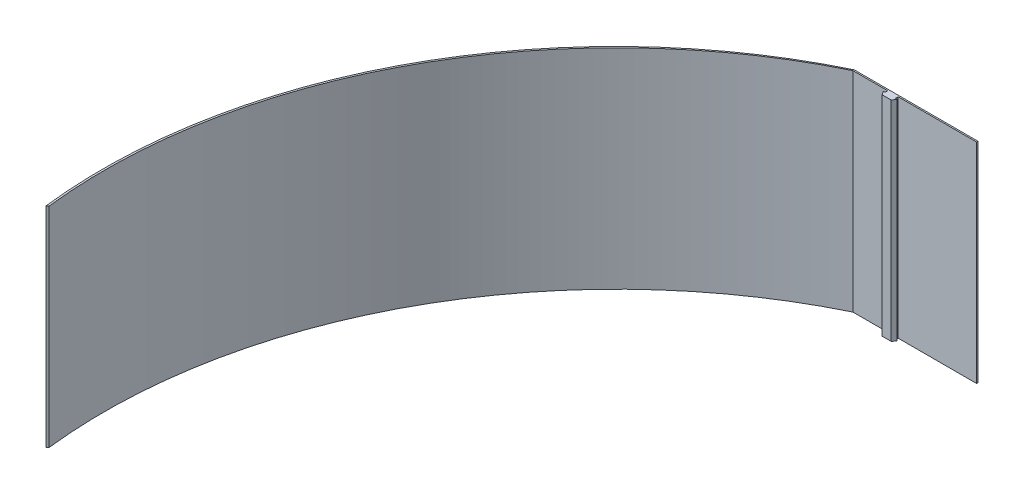
ISO-10303-21;
HEADER;
FILE_DESCRIPTION(('STEP AP214'),'2;1');
FILE_NAME('part.step','',(''),(''),'','','');
FILE_SCHEMA(('AUTOMOTIVE_DESIGN { 1 0 10303 214 1 1 1 1 }'));
ENDSEC;
DATA;
#1=APPLICATION_CONTEXT('core data for automotive mechanical design processes');
#2=APPLICATION_PROTOCOL_DEFINITION('international standard','automotive_design',2000,#1);
#3=PRODUCT_CONTEXT('',#1,'mechanical');
#4=PRODUCT('Part','Part','',(#3));
#5=PRODUCT_RELATED_PRODUCT_CATEGORY('part','',(#4));
#6=PRODUCT_DEFINITION_FORMATION('','',#4);
#7=PRODUCT_DEFINITION_CONTEXT('part definition',#1,'design');
#8=PRODUCT_DEFINITION('design','',#6,#7);
#9=PRODUCT_DEFINITION_SHAPE('','',#8);
#10=(LENGTH_UNIT() NAMED_UNIT(*) SI_UNIT(.MILLI.,.METRE.));
#11=(NAMED_UNIT(*) PLANE_ANGLE_UNIT() SI_UNIT($,.RADIAN.));
#12=(NAMED_UNIT(*) SI_UNIT($,.STERADIAN.) SOLID_ANGLE_UNIT());
#13=UNCERTAINTY_MEASURE_WITH_UNIT(LENGTH_MEASURE(1.E-05),#10,'distance_accuracy_value','');
#14=(GEOMETRIC_REPRESENTATION_CONTEXT(3) GLOBAL_UNCERTAINTY_ASSIGNED_CONTEXT((#13)) GLOBAL_UNIT_ASSIGNED_CONTEXT((#10,
#11,#12)) REPRESENTATION_CONTEXT('',''));
#15=CARTESIAN_POINT('',(0.,0.,0.));
#16=DIRECTION('',(0.,0.,1.));
#17=DIRECTION('',(1.,0.,0.));
#18=AXIS2_PLACEMENT_3D('',#15,#16,#17);
#19=CARTESIAN_POINT('',(-3.,120.,0.));
#20=DIRECTION('',(0.,0.,-1.));
#21=DIRECTION('',(-1.,0.,0.));
#22=AXIS2_PLACEMENT_3D('',#19,#20,#21);
#23=PLANE('',#22);
#24=DIRECTION('',(1.,0.,0.));
#25=VECTOR('',#24,1.);
#26=CARTESIAN_POINT('',(-3.,0.,0.));
#27=LINE('',#26,#25);
#28=CARTESIAN_POINT('',(-23.,0.,0.));
#29=VERTEX_POINT('',#28);
#30=CARTESIAN_POINT('',(-3.,0.,0.));
#31=VERTEX_POINT('',#30);
#32=EDGE_CURVE('E165',#29,#31,#27,.T.);
#33=ORIENTED_EDGE('',*,*,#32,.T.);
#34=DIRECTION('',(0.,-1.,0.));
#35=VECTOR('',#34,1.);
#36=CARTESIAN_POINT('',(-3.,120.,0.));
#37=LINE('',#36,#35);
#38=CARTESIAN_POINT('',(-3.,120.,0.));
#39=VERTEX_POINT('',#38);
#40=EDGE_CURVE('E11',#39,#31,#37,.T.);
#41=ORIENTED_EDGE('',*,*,#40,.F.);
#42=DIRECTION('',(1.,0.,0.));
#43=VECTOR('',#42,1.);
#44=CARTESIAN_POINT('',(-3.,120.,0.));
#45=LINE('',#44,#43);
#46=CARTESIAN_POINT('',(-23.,120.,0.));
#47=VERTEX_POINT('',#46);
#48=EDGE_CURVE('E191',#47,#39,#45,.T.);
#49=ORIENTED_EDGE('',*,*,#48,.F.);
#50=DIRECTION('',(0.,-1.,0.));
#51=VECTOR('',#50,1.);
#52=CARTESIAN_POINT('',(-23.,120.,0.));
#53=LINE('',#52,#51);
#54=EDGE_CURVE('E161',#47,#29,#53,.T.);
#55=ORIENTED_EDGE('',*,*,#54,.T.);
#56=EDGE_LOOP('',(#33,#41,#49,#55));
#57=FACE_BOUND('',#56,.T.);
#58=ADVANCED_FACE('F33',(#57),#23,.F.);
#59=CARTESIAN_POINT('',(-3.,120.,0.));
#60=DIRECTION('',(1.,0.,0.));
#61=DIRECTION('',(0.,0.,-1.));
#62=AXIS2_PLACEMENT_3D('',#59,#60,#61);
#63=PLANE('',#62);
#64=DIRECTION('',(0.,0.,1.));
#65=VECTOR('',#64,1.);
#66=CARTESIAN_POINT('',(-3.,0.,0.));
#67=LINE('',#66,#65);
#68=CARTESIAN_POINT('',(-3.,0.,1.6));
#69=VERTEX_POINT('',#68);
#70=EDGE_CURVE('E168',#31,#69,#67,.T.);
#71=ORIENTED_EDGE('',*,*,#70,.T.);
#72=DIRECTION('',(0.,-1.,0.));
#73=VECTOR('',#72,1.);
#74=CARTESIAN_POINT('',(-3.,120.,1.6));
#75=LINE('',#74,#73);
#76=CARTESIAN_POINT('',(-3.,120.,1.6));
#77=VERTEX_POINT('',#76);
#78=EDGE_CURVE('E41',#77,#69,#75,.T.);
#79=ORIENTED_EDGE('',*,*,#78,.F.);
#80=DIRECTION('',(0.,0.,1.));
#81=VECTOR('',#80,1.);
#82=CARTESIAN_POINT('',(-3.,120.,0.));
#83=LINE('',#82,#81);
#84=EDGE_CURVE('E110',#39,#77,#83,.T.);
#85=ORIENTED_EDGE('',*,*,#84,.F.);
#86=ORIENTED_EDGE('',*,*,#40,.T.);
#87=EDGE_LOOP('',(#71,#79,#85,#86));
#88=FACE_BOUND('',#87,.T.);
#89=ADVANCED_FACE('F279',(#88),#63,.F.);
#90=CARTESIAN_POINT('',(-3.,120.,1.6));
#91=DIRECTION('',(0.,0.,1.));
#92=DIRECTION('',(1.,0.,0.));
#93=AXIS2_PLACEMENT_3D('',#90,#91,#92);
#94=PLANE('',#93);
#95=DIRECTION('',(-1.,0.,0.));
#96=VECTOR('',#95,1.);
#97=CARTESIAN_POINT('',(-3.,0.,1.6));
#98=LINE('',#97,#96);
#99=CARTESIAN_POINT('',(-4.,0.,1.6));
#100=VERTEX_POINT('',#99);
#101=EDGE_CURVE('E170',#69,#100,#98,.T.);
#102=ORIENTED_EDGE('',*,*,#101,.T.);
#103=DIRECTION('',(0.,-1.,0.));
#104=VECTOR('',#103,1.);
#105=CARTESIAN_POINT('',(-4.,120.,1.6));
#106=LINE('',#105,#104);
#107=CARTESIAN_POINT('',(-4.,120.,1.6));
#108=VERTEX_POINT('',#107);
#109=EDGE_CURVE('E216',#108,#100,#106,.T.);
#110=ORIENTED_EDGE('',*,*,#109,.F.);
#111=DIRECTION('',(-1.,0.,0.));
#112=VECTOR('',#111,1.);
#113=CARTESIAN_POINT('',(-3.,120.,1.6));
#114=LINE('',#113,#112);
#115=EDGE_CURVE('E224',#77,#108,#114,.T.);
#116=ORIENTED_EDGE('',*,*,#115,.F.);
#117=ORIENTED_EDGE('',*,*,#78,.T.);
#118=EDGE_LOOP('',(#102,#110,#116,#117));
#119=FACE_BOUND('',#118,.T.);
#120=ADVANCED_FACE('F222',(#119),#94,.F.);
#121=CARTESIAN_POINT('',(-4.,120.,1.6));
#122=DIRECTION('',(0.819152044288993,0.,-0.573576436351045));
#123=DIRECTION('',(-0.573576436351045,0.,-0.819152044288993));
#124=AXIS2_PLACEMENT_3D('',#121,#122,#123);
#125=PLANE('',#124);
#126=DIRECTION('',(0.573576436351045,0.,0.819152044288993));
#127=VECTOR('',#126,1.);
#128=CARTESIAN_POINT('',(-4.,0.,1.6));
#129=LINE('',#128,#127);
#130=CARTESIAN_POINT('',(-2.59958492358059,0.,3.6));
#131=VERTEX_POINT('',#130);
#132=EDGE_CURVE('E172',#100,#131,#129,.T.);
#133=ORIENTED_EDGE('',*,*,#132,.T.);
#134=DIRECTION('',(0.,-1.,0.));
#135=VECTOR('',#134,1.);
#136=CARTESIAN_POINT('',(-2.59958492358059,120.,3.6));
#137=LINE('',#136,#135);
#138=CARTESIAN_POINT('',(-2.59958492358059,120.,3.6));
#139=VERTEX_POINT('',#138);
#140=EDGE_CURVE('E213',#139,#131,#137,.T.);
#141=ORIENTED_EDGE('',*,*,#140,.F.);
#142=DIRECTION('',(0.573576436351045,0.,0.819152044288993));
#143=VECTOR('',#142,1.);
#144=CARTESIAN_POINT('',(-4.,120.,1.6));
#145=LINE('',#144,#143);
#146=EDGE_CURVE('E242',#108,#139,#145,.T.);
#147=ORIENTED_EDGE('',*,*,#146,.F.);
#148=ORIENTED_EDGE('',*,*,#109,.T.);
#149=EDGE_LOOP('',(#133,#141,#147,#148));
#150=FACE_BOUND('',#149,.T.);
#151=ADVANCED_FACE('F233',(#150),#125,.F.);
#152=CARTESIAN_POINT('',(-2.59958492358059,120.,3.6));
#153=DIRECTION('',(0.,0.,-1.));
#154=DIRECTION('',(-1.,0.,0.));
#155=AXIS2_PLACEMENT_3D('',#152,#153,#154);
#156=PLANE('',#155);
#157=DIRECTION('',(1.,0.,0.));
#158=VECTOR('',#157,1.);
#159=CARTESIAN_POINT('',(-2.59958492358059,0.,3.6));
#160=LINE('',#159,#158);
#161=CARTESIAN_POINT('',(2.59958492358059,0.,3.6));
#162=VERTEX_POINT('',#161);
#163=EDGE_CURVE('E174',#131,#162,#160,.T.);
#164=ORIENTED_EDGE('',*,*,#163,.T.);
#165=DIRECTION('',(0.,-1.,0.));
#166=VECTOR('',#165,1.);
#167=CARTESIAN_POINT('',(2.59958492358059,120.,3.6));
#168=LINE('',#167,#166);
#169=CARTESIAN_POINT('',(2.59958492358059,120.,3.6));
#170=VERTEX_POINT('',#169);
#171=EDGE_CURVE('E210',#170,#162,#168,.T.);
#172=ORIENTED_EDGE('',*,*,#171,.F.);
#173=DIRECTION('',(1.,0.,0.));
#174=VECTOR('',#173,1.);
#175=CARTESIAN_POINT('',(-2.59958492358059,120.,3.6));
#176=LINE('',#175,#174);
#177=EDGE_CURVE('E239',#139,#170,#176,.T.);
#178=ORIENTED_EDGE('',*,*,#177,.F.);
#179=ORIENTED_EDGE('',*,*,#140,.T.);
#180=EDGE_LOOP('',(#164,#172,#178,#179));
#181=FACE_BOUND('',#180,.T.);
#182=ADVANCED_FACE('F237',(#181),#156,.F.);
#183=CARTESIAN_POINT('',(2.59958492358059,120.,3.6));
#184=DIRECTION('',(-0.819152044288993,0.,-0.573576436351044));
#185=DIRECTION('',(-0.573576436351044,0.,0.819152044288993));
#186=AXIS2_PLACEMENT_3D('',#183,#184,#185);
#187=PLANE('',#186);
#188=DIRECTION('',(0.573576436351044,0.,-0.819152044288993));
#189=VECTOR('',#188,1.);
#190=CARTESIAN_POINT('',(2.59958492358059,0.,3.6));
#191=LINE('',#190,#189);
#192=CARTESIAN_POINT('',(4.,0.,1.6));
#193=VERTEX_POINT('',#192);
#194=EDGE_CURVE('E176',#162,#193,#191,.T.);
#195=ORIENTED_EDGE('',*,*,#194,.T.);
#196=DIRECTION('',(0.,-1.,0.));
#197=VECTOR('',#196,1.);
#198=CARTESIAN_POINT('',(4.,120.,1.6));
#199=LINE('',#198,#197);
#200=CARTESIAN_POINT('',(4.,120.,1.6));
#201=VERTEX_POINT('',#200);
#202=EDGE_CURVE('E207',#201,#193,#199,.T.);
#203=ORIENTED_EDGE('',*,*,#202,.F.);
#204=DIRECTION('',(0.573576436351044,0.,-0.819152044288993));
#205=VECTOR('',#204,1.);
#206=CARTESIAN_POINT('',(2.59958492358059,120.,3.6));
#207=LINE('',#206,#205);
#208=EDGE_CURVE('E241',#170,#201,#207,.T.);
#209=ORIENTED_EDGE('',*,*,#208,.F.);
#210=ORIENTED_EDGE('',*,*,#171,.T.);
#211=EDGE_LOOP('',(#195,#203,#209,#210));
#212=FACE_BOUND('',#211,.T.);
#213=ADVANCED_FACE('F292',(#212),#187,.F.);
#214=CARTESIAN_POINT('',(4.,120.,1.6));
#215=DIRECTION('',(0.,0.,1.));
#216=DIRECTION('',(1.,0.,0.));
#217=AXIS2_PLACEMENT_3D('',#214,#215,#216);
#218=PLANE('',#217);
#219=DIRECTION('',(-1.,0.,0.));
#220=VECTOR('',#219,1.);
#221=CARTESIAN_POINT('',(4.,0.,1.6));
#222=LINE('',#221,#220);
#223=CARTESIAN_POINT('',(3.,0.,1.6));
#224=VERTEX_POINT('',#223);
#225=EDGE_CURVE('E178',#193,#224,#222,.T.);
#226=ORIENTED_EDGE('',*,*,#225,.T.);
#227=DIRECTION('',(0.,-1.,0.));
#228=VECTOR('',#227,1.);
#229=CARTESIAN_POINT('',(3.,120.,1.6));
#230=LINE('',#229,#228);
#231=CARTESIAN_POINT('',(3.,120.,1.6));
#232=VERTEX_POINT('',#231);
#233=EDGE_CURVE('E204',#232,#224,#230,.T.);
#234=ORIENTED_EDGE('',*,*,#233,.F.);
#235=DIRECTION('',(-1.,0.,0.));
#236=VECTOR('',#235,1.);
#237=CARTESIAN_POINT('',(4.,120.,1.6));
#238=LINE('',#237,#236);
#239=EDGE_CURVE('E244',#201,#232,#238,.T.);
#240=ORIENTED_EDGE('',*,*,#239,.F.);
#241=ORIENTED_EDGE('',*,*,#202,.T.);
#242=EDGE_LOOP('',(#226,#234,#240,#241));
#243=FACE_BOUND('',#242,.T.);
#244=ADVANCED_FACE('F295',(#243),#218,.F.);
#245=CARTESIAN_POINT('',(3.,120.,1.6));
#246=DIRECTION('',(-1.,0.,0.));
#247=DIRECTION('',(0.,0.,1.));
#248=AXIS2_PLACEMENT_3D('',#245,#246,#247);
#249=PLANE('',#248);
#250=DIRECTION('',(0.,0.,-1.));
#251=VECTOR('',#250,1.);
#252=CARTESIAN_POINT('',(3.,0.,1.6));
#253=LINE('',#252,#251);
#254=CARTESIAN_POINT('',(3.,0.,0.));
#255=VERTEX_POINT('',#254);
#256=EDGE_CURVE('E180',#224,#255,#253,.T.);
#257=ORIENTED_EDGE('',*,*,#256,.T.);
#258=DIRECTION('',(0.,-1.,0.));
#259=VECTOR('',#258,1.);
#260=CARTESIAN_POINT('',(3.,120.,0.));
#261=LINE('',#260,#259);
#262=CARTESIAN_POINT('',(3.,120.,0.));
#263=VERTEX_POINT('',#262);
#264=EDGE_CURVE('E201',#263,#255,#261,.T.);
#265=ORIENTED_EDGE('',*,*,#264,.F.);
#266=DIRECTION('',(0.,0.,-1.));
#267=VECTOR('',#266,1.);
#268=CARTESIAN_POINT('',(3.,120.,1.6));
#269=LINE('',#268,#267);
#270=EDGE_CURVE('E250',#232,#263,#269,.T.);
#271=ORIENTED_EDGE('',*,*,#270,.F.);
#272=ORIENTED_EDGE('',*,*,#233,.T.);
#273=EDGE_LOOP('',(#257,#265,#271,#272));
#274=FACE_BOUND('',#273,.T.);
#275=ADVANCED_FACE('F299',(#274),#249,.F.);
#276=CARTESIAN_POINT('',(48.,120.,0.));
#277=DIRECTION('',(0.,0.,-1.));
#278=DIRECTION('',(-1.,0.,0.));
#279=AXIS2_PLACEMENT_3D('',#276,#277,#278);
#280=PLANE('',#279);
#281=DIRECTION('',(1.,0.,0.));
#282=VECTOR('',#281,1.);
#283=CARTESIAN_POINT('',(48.,0.,0.));
#284=LINE('',#283,#282);
#285=CARTESIAN_POINT('',(48.,0.,0.));
#286=VERTEX_POINT('',#285);
#287=EDGE_CURVE('E182',#255,#286,#284,.T.);
#288=ORIENTED_EDGE('',*,*,#287,.T.);
#289=DIRECTION('',(0.,-1.,0.));
#290=VECTOR('',#289,1.);
#291=CARTESIAN_POINT('',(48.,120.,0.));
#292=LINE('',#291,#290);
#293=CARTESIAN_POINT('',(48.,120.,0.));
#294=VERTEX_POINT('',#293);
#295=EDGE_CURVE('E198',#294,#286,#292,.T.);
#296=ORIENTED_EDGE('',*,*,#295,.F.);
#297=DIRECTION('',(1.,0.,0.));
#298=VECTOR('',#297,1.);
#299=CARTESIAN_POINT('',(48.,120.,0.));
#300=LINE('',#299,#298);
#301=EDGE_CURVE('E252',#263,#294,#300,.T.);
#302=ORIENTED_EDGE('',*,*,#301,.F.);
#303=ORIENTED_EDGE('',*,*,#264,.T.);
#304=EDGE_LOOP('',(#288,#296,#302,#303));
#305=FACE_BOUND('',#304,.T.);
#306=ADVANCED_FACE('F303',(#305),#280,.F.);
#307=CARTESIAN_POINT('',(48.,120.,-0.799999999999997));
#308=DIRECTION('',(-1.,0.,0.));
#309=DIRECTION('',(0.,0.,1.));
#310=AXIS2_PLACEMENT_3D('',#307,#308,#309);
#311=PLANE('',#310);
#312=DIRECTION('',(0.,0.,-1.));
#313=VECTOR('',#312,1.);
#314=CARTESIAN_POINT('',(48.,0.,-0.799999999999997));
#315=LINE('',#314,#313);
#316=CARTESIAN_POINT('',(48.,0.,-0.799999999999997));
#317=VERTEX_POINT('',#316);
#318=EDGE_CURVE('E184',#286,#317,#315,.T.);
#319=ORIENTED_EDGE('',*,*,#318,.T.);
#320=DIRECTION('',(0.,-1.,0.));
#321=VECTOR('',#320,1.);
#322=CARTESIAN_POINT('',(48.,120.,-0.799999999999997));
#323=LINE('',#322,#321);
#324=CARTESIAN_POINT('',(48.,120.,-0.799999999999997));
#325=VERTEX_POINT('',#324);
#326=EDGE_CURVE('E195',#325,#317,#323,.T.);
#327=ORIENTED_EDGE('',*,*,#326,.F.);
#328=DIRECTION('',(0.,0.,-1.));
#329=VECTOR('',#328,1.);
#330=CARTESIAN_POINT('',(48.,120.,-0.799999999999997));
#331=LINE('',#330,#329);
#332=EDGE_CURVE('E254',#294,#325,#331,.T.);
#333=ORIENTED_EDGE('',*,*,#332,.F.);
#334=ORIENTED_EDGE('',*,*,#295,.T.);
#335=EDGE_LOOP('',(#319,#327,#333,#334));
#336=FACE_BOUND('',#335,.T.);
#337=ADVANCED_FACE('F260',(#336),#311,.F.);
#338=CARTESIAN_POINT('',(-23.,120.,-0.799999999999997));
#339=DIRECTION('',(0.,0.,1.));
#340=DIRECTION('',(1.,0.,0.));
#341=AXIS2_PLACEMENT_3D('',#338,#339,#340);
#342=PLANE('',#341);
#343=DIRECTION('',(-1.,0.,0.));
#344=VECTOR('',#343,1.);
#345=CARTESIAN_POINT('',(-23.,0.,-0.799999999999997));
#346=LINE('',#345,#344);
#347=CARTESIAN_POINT('',(-23.,0.,-0.799999999999997));
#348=VERTEX_POINT('',#347);
#349=EDGE_CURVE('E186',#317,#348,#346,.T.);
#350=ORIENTED_EDGE('',*,*,#349,.T.);
#351=DIRECTION('',(0.,-1.,0.));
#352=VECTOR('',#351,1.);
#353=CARTESIAN_POINT('',(-23.,120.,-0.799999999999997));
#354=LINE('',#353,#352);
#355=CARTESIAN_POINT('',(-23.,120.,-0.799999999999997));
#356=VERTEX_POINT('',#355);
#357=EDGE_CURVE('E156',#356,#348,#354,.T.);
#358=ORIENTED_EDGE('',*,*,#357,.F.);
#359=DIRECTION('',(-1.,0.,0.));
#360=VECTOR('',#359,1.);
#361=CARTESIAN_POINT('',(-23.,120.,-0.799999999999997));
#362=LINE('',#361,#360);
#363=EDGE_CURVE('E147',#325,#356,#362,.T.);
#364=ORIENTED_EDGE('',*,*,#363,.F.);
#365=ORIENTED_EDGE('',*,*,#326,.T.);
#366=EDGE_LOOP('',(#350,#358,#364,#365));
#367=FACE_BOUND('',#366,.T.);
#368=ADVANCED_FACE('F264',(#367),#342,.F.);
#369=CARTESIAN_POINT('',(104.838197524432,120.,264.164788223313));
#370=DIRECTION('',(0.,-1.,0.));
#371=DIRECTION('',(0.,0.,-1.));
#372=AXIS2_PLACEMENT_3D('',#369,#370,#371);
#373=CYLINDRICAL_SURFACE('',#372,294.19201849221);
#374=CARTESIAN_POINT('',(104.838197524432,0.,264.164788223313));
#375=DIRECTION('',(0.,1.,0.));
#376=DIRECTION('',(0.,0.,1.));
#377=AXIS2_PLACEMENT_3D('',#374,#375,#376);
#378=CIRCLE('',#377,294.19201849221);
#379=CARTESIAN_POINT('',(-187.317261189336,0.,298.720998783339));
#380=VERTEX_POINT('',#379);
#381=EDGE_CURVE('E155',#348,#380,#378,.T.);
#382=ORIENTED_EDGE('',*,*,#381,.T.);
#383=DIRECTION('',(0.,-1.,0.));
#384=VECTOR('',#383,1.);
#385=CARTESIAN_POINT('',(-187.317261189336,120.,298.720998783339));
#386=LINE('',#385,#384);
#387=CARTESIAN_POINT('',(-187.317261189336,120.,298.720998783339));
#388=VERTEX_POINT('',#387);
#389=EDGE_CURVE('E152',#388,#380,#386,.T.);
#390=ORIENTED_EDGE('',*,*,#389,.F.);
#391=CARTESIAN_POINT('',(104.838197524432,120.,264.164788223313));
#392=DIRECTION('',(0.,1.,0.));
#393=DIRECTION('',(0.,0.,1.));
#394=AXIS2_PLACEMENT_3D('',#391,#392,#393);
#395=CIRCLE('',#394,294.19201849221);
#396=EDGE_CURVE('E141',#356,#388,#395,.T.);
#397=ORIENTED_EDGE('',*,*,#396,.F.);
#398=ORIENTED_EDGE('',*,*,#357,.T.);
#399=EDGE_LOOP('',(#382,#390,#397,#398));
#400=FACE_BOUND('',#399,.T.);
#401=ADVANCED_FACE('F153',(#400),#373,.T.);
#402=CARTESIAN_POINT('',(-187.317261189336,120.,298.720998783339));
#403=DIRECTION('',(-0.612216622520778,0.,-0.790690082844885));
#404=DIRECTION('',(-0.790690082844885,0.,0.612216622520778));
#405=AXIS2_PLACEMENT_3D('',#402,#403,#404);
#406=PLANE('',#405);
#407=DIRECTION('',(0.790690082844885,0.,-0.612216622520778));
#408=VECTOR('',#407,1.);
#409=CARTESIAN_POINT('',(-187.317261189336,0.,298.720998783339));
#410=LINE('',#409,#408);
#411=CARTESIAN_POINT('',(-186.319141296679,0.,297.948173117746));
#412=VERTEX_POINT('',#411);
#413=EDGE_CURVE('E96',#380,#412,#410,.T.);
#414=ORIENTED_EDGE('',*,*,#413,.T.);
#415=DIRECTION('',(0.,-1.,0.));
#416=VECTOR('',#415,1.);
#417=CARTESIAN_POINT('',(-186.319141296679,120.,297.948173117746));
#418=LINE('',#417,#416);
#419=CARTESIAN_POINT('',(-186.319141296679,120.,297.948173117746));
#420=VERTEX_POINT('',#419);
#421=EDGE_CURVE('E157',#420,#412,#418,.T.);
#422=ORIENTED_EDGE('',*,*,#421,.F.);
#423=DIRECTION('',(0.790690082844885,0.,-0.612216622520778));
#424=VECTOR('',#423,1.);
#425=CARTESIAN_POINT('',(-187.317261189336,120.,298.720998783339));
#426=LINE('',#425,#424);
#427=EDGE_CURVE('E145',#388,#420,#426,.T.);
#428=ORIENTED_EDGE('',*,*,#427,.F.);
#429=ORIENTED_EDGE('',*,*,#389,.T.);
#430=EDGE_LOOP('',(#414,#422,#428,#429));
#431=FACE_BOUND('',#430,.T.);
#432=ADVANCED_FACE('F159',(#431),#406,.F.);
#433=CARTESIAN_POINT('',(105.634090684314,120.,264.245745483967));
#434=DIRECTION('',(0.,-1.,0.));
#435=DIRECTION('',(0.,0.,-1.));
#436=AXIS2_PLACEMENT_3D('',#433,#434,#435);
#437=CYLINDRICAL_SURFACE('',#436,293.892060615046);
#438=CARTESIAN_POINT('',(105.634090684314,0.,264.245745483967));
#439=DIRECTION('',(0.,-1.,0.));
#440=DIRECTION('',(0.,0.,1.));
#441=AXIS2_PLACEMENT_3D('',#438,#439,#440);
#442=CIRCLE('',#441,293.892060615046);
#443=EDGE_CURVE('E102',#412,#29,#442,.T.);
#444=ORIENTED_EDGE('',*,*,#443,.T.);
#445=ORIENTED_EDGE('',*,*,#54,.F.);
#446=CARTESIAN_POINT('',(105.634090684314,120.,264.245745483967));
#447=DIRECTION('',(0.,-1.,0.));
#448=DIRECTION('',(0.,0.,1.));
#449=AXIS2_PLACEMENT_3D('',#446,#447,#448);
#450=CIRCLE('',#449,293.892060615046);
#451=EDGE_CURVE('E49',#420,#47,#450,.T.);
#452=ORIENTED_EDGE('',*,*,#451,.F.);
#453=ORIENTED_EDGE('',*,*,#421,.T.);
#454=EDGE_LOOP('',(#444,#445,#452,#453));
#455=FACE_BOUND('',#454,.T.);
#456=ADVANCED_FACE('F268',(#455),#437,.F.);
#457=CARTESIAN_POINT('',(105.634090684314,120.,264.245745483967));
#458=DIRECTION('',(0.,1.,0.));
#459=DIRECTION('',(0.,0.,1.));
#460=AXIS2_PLACEMENT_3D('',#457,#458,#459);
#461=PLANE('',#460);
#462=ORIENTED_EDGE('',*,*,#48,.T.);
#463=ORIENTED_EDGE('',*,*,#84,.T.);
#464=ORIENTED_EDGE('',*,*,#115,.T.);
#465=ORIENTED_EDGE('',*,*,#146,.T.);
#466=ORIENTED_EDGE('',*,*,#177,.T.);
#467=ORIENTED_EDGE('',*,*,#208,.T.);
#468=ORIENTED_EDGE('',*,*,#239,.T.);
#469=ORIENTED_EDGE('',*,*,#270,.T.);
#470=ORIENTED_EDGE('',*,*,#301,.T.);
#471=ORIENTED_EDGE('',*,*,#332,.T.);
#472=ORIENTED_EDGE('',*,*,#363,.T.);
#473=ORIENTED_EDGE('',*,*,#396,.T.);
#474=ORIENTED_EDGE('',*,*,#427,.T.);
#475=ORIENTED_EDGE('',*,*,#451,.T.);
#476=EDGE_LOOP('',(#462,#463,#464,#465,#466,#467,#468,#469,#470,#471,#472,#473,#474,#475));
#477=FACE_BOUND('',#476,.T.);
#478=ADVANCED_FACE('F143',(#477),#461,.T.);
#479=CARTESIAN_POINT('',(105.634090684314,0.,264.245745483967));
#480=DIRECTION('',(0.,1.,0.));
#481=DIRECTION('',(0.,0.,1.));
#482=AXIS2_PLACEMENT_3D('',#479,#480,#481);
#483=PLANE('',#482);
#484=ORIENTED_EDGE('',*,*,#32,.F.);
#485=ORIENTED_EDGE('',*,*,#443,.F.);
#486=ORIENTED_EDGE('',*,*,#413,.F.);
#487=ORIENTED_EDGE('',*,*,#381,.F.);
#488=ORIENTED_EDGE('',*,*,#349,.F.);
#489=ORIENTED_EDGE('',*,*,#318,.F.);
#490=ORIENTED_EDGE('',*,*,#287,.F.);
#491=ORIENTED_EDGE('',*,*,#256,.F.);
#492=ORIENTED_EDGE('',*,*,#225,.F.);
#493=ORIENTED_EDGE('',*,*,#194,.F.);
#494=ORIENTED_EDGE('',*,*,#163,.F.);
#495=ORIENTED_EDGE('',*,*,#132,.F.);
#496=ORIENTED_EDGE('',*,*,#101,.F.);
#497=ORIENTED_EDGE('',*,*,#70,.F.);
#498=EDGE_LOOP('',(#484,#485,#486,#487,#488,#489,#490,#491,#492,#493,#494,#495,#496,#497));
#499=FACE_BOUND('',#498,.T.);
#500=ADVANCED_FACE('F228',(#499),#483,.F.);
#501=CLOSED_SHELL('',(#58,#89,#120,#151,#182,#213,#244,#275,#306,#337,#368,#401,#432,#456,#478,#500));
#502=MANIFOLD_SOLID_BREP('B2',#501);
#503=ADVANCED_BREP_SHAPE_REPRESENTATION('',(#18,#502),#14);
#504=SHAPE_DEFINITION_REPRESENTATION(#9,#503);
ENDSEC;
END-ISO-10303-21;
